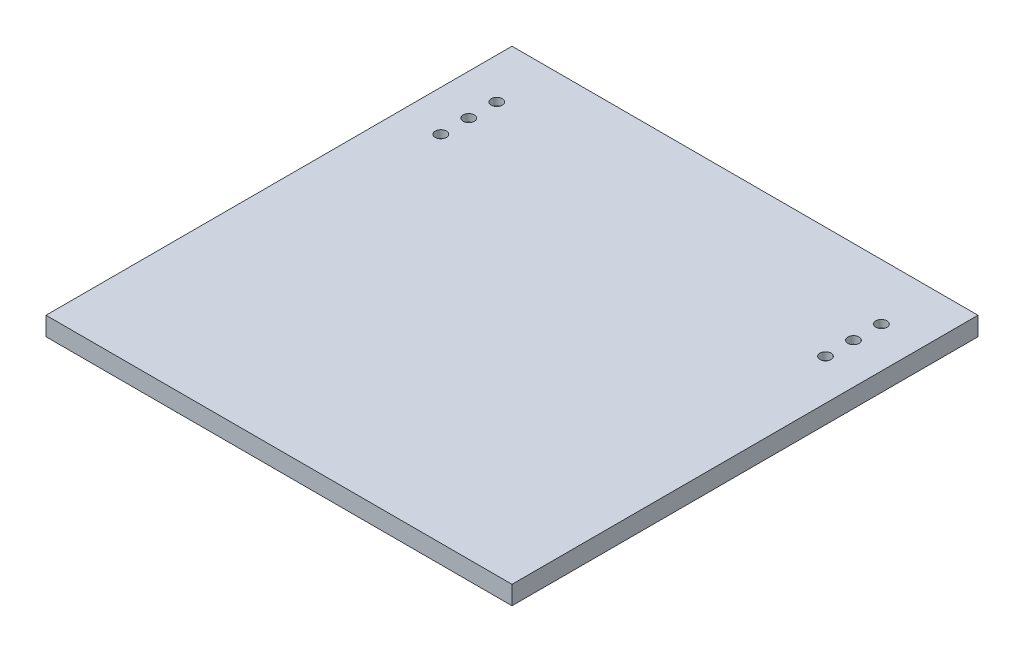
ISO-10303-21;
HEADER;
FILE_DESCRIPTION(('STEP AP214'),'2;1');
FILE_NAME('part.step','',(''),(''),'','','');
FILE_SCHEMA(('AUTOMOTIVE_DESIGN { 1 0 10303 214 1 1 1 1 }'));
ENDSEC;
DATA;
#1=APPLICATION_CONTEXT('core data for automotive mechanical design processes');
#2=APPLICATION_PROTOCOL_DEFINITION('international standard','automotive_design',2000,#1);
#3=PRODUCT_CONTEXT('',#1,'mechanical');
#4=PRODUCT('Part','Part','',(#3));
#5=PRODUCT_RELATED_PRODUCT_CATEGORY('part','',(#4));
#6=PRODUCT_DEFINITION_FORMATION('','',#4);
#7=PRODUCT_DEFINITION_CONTEXT('part definition',#1,'design');
#8=PRODUCT_DEFINITION('design','',#6,#7);
#9=PRODUCT_DEFINITION_SHAPE('','',#8);
#10=(LENGTH_UNIT() NAMED_UNIT(*) SI_UNIT(.MILLI.,.METRE.));
#11=(NAMED_UNIT(*) PLANE_ANGLE_UNIT() SI_UNIT($,.RADIAN.));
#12=(NAMED_UNIT(*) SI_UNIT($,.STERADIAN.) SOLID_ANGLE_UNIT());
#13=UNCERTAINTY_MEASURE_WITH_UNIT(LENGTH_MEASURE(1.E-05),#10,'distance_accuracy_value','');
#14=(GEOMETRIC_REPRESENTATION_CONTEXT(3) GLOBAL_UNCERTAINTY_ASSIGNED_CONTEXT((#13)) GLOBAL_UNIT_ASSIGNED_CONTEXT((#10,
#11,#12)) REPRESENTATION_CONTEXT('',''));
#15=CARTESIAN_POINT('',(0.,0.,0.));
#16=DIRECTION('',(0.,0.,1.));
#17=DIRECTION('',(1.,0.,0.));
#18=AXIS2_PLACEMENT_3D('',#15,#16,#17);
#19=CARTESIAN_POINT('',(0.,5.,0.));
#20=DIRECTION('',(1.,0.,0.));
#21=DIRECTION('',(0.,0.,-1.));
#22=AXIS2_PLACEMENT_3D('',#19,#20,#21);
#23=PLANE('',#22);
#24=DIRECTION('',(0.,0.,1.));
#25=VECTOR('',#24,1.);
#26=CARTESIAN_POINT('',(0.,0.,0.));
#27=LINE('',#26,#25);
#28=CARTESIAN_POINT('',(0.,0.,-125.));
#29=VERTEX_POINT('',#28);
#30=CARTESIAN_POINT('',(0.,0.,0.));
#31=VERTEX_POINT('',#30);
#32=EDGE_CURVE('E103',#29,#31,#27,.T.);
#33=ORIENTED_EDGE('',*,*,#32,.T.);
#34=DIRECTION('',(0.,-1.,0.));
#35=VECTOR('',#34,1.);
#36=CARTESIAN_POINT('',(0.,5.,0.));
#37=LINE('',#36,#35);
#38=CARTESIAN_POINT('',(0.,5.,0.));
#39=VERTEX_POINT('',#38);
#40=EDGE_CURVE('E11',#39,#31,#37,.T.);
#41=ORIENTED_EDGE('',*,*,#40,.F.);
#42=DIRECTION('',(0.,0.,1.));
#43=VECTOR('',#42,1.);
#44=CARTESIAN_POINT('',(0.,5.,0.));
#45=LINE('',#44,#43);
#46=CARTESIAN_POINT('',(0.,5.,-125.));
#47=VERTEX_POINT('',#46);
#48=EDGE_CURVE('E90',#47,#39,#45,.T.);
#49=ORIENTED_EDGE('',*,*,#48,.F.);
#50=DIRECTION('',(0.,-1.,0.));
#51=VECTOR('',#50,1.);
#52=CARTESIAN_POINT('',(0.,5.,-125.));
#53=LINE('',#52,#51);
#54=EDGE_CURVE('E99',#47,#29,#53,.T.);
#55=ORIENTED_EDGE('',*,*,#54,.T.);
#56=EDGE_LOOP('',(#33,#41,#49,#55));
#57=FACE_BOUND('',#56,.T.);
#58=ADVANCED_FACE('F37',(#57),#23,.F.);
#59=CARTESIAN_POINT('',(0.,5.,0.));
#60=DIRECTION('',(0.,0.,-1.));
#61=DIRECTION('',(-1.,0.,0.));
#62=AXIS2_PLACEMENT_3D('',#59,#60,#61);
#63=PLANE('',#62);
#64=DIRECTION('',(1.,0.,0.));
#65=VECTOR('',#64,1.);
#66=CARTESIAN_POINT('',(0.,0.,0.));
#67=LINE('',#66,#65);
#68=CARTESIAN_POINT('',(125.,0.,0.));
#69=VERTEX_POINT('',#68);
#70=EDGE_CURVE('E94',#31,#69,#67,.T.);
#71=ORIENTED_EDGE('',*,*,#70,.T.);
#72=DIRECTION('',(0.,-1.,0.));
#73=VECTOR('',#72,1.);
#74=CARTESIAN_POINT('',(125.,5.,0.));
#75=LINE('',#74,#73);
#76=CARTESIAN_POINT('',(125.,5.,0.));
#77=VERTEX_POINT('',#76);
#78=EDGE_CURVE('E46',#77,#69,#75,.T.);
#79=ORIENTED_EDGE('',*,*,#78,.F.);
#80=DIRECTION('',(1.,0.,0.));
#81=VECTOR('',#80,1.);
#82=CARTESIAN_POINT('',(0.,5.,0.));
#83=LINE('',#82,#81);
#84=EDGE_CURVE('E85',#39,#77,#83,.T.);
#85=ORIENTED_EDGE('',*,*,#84,.F.);
#86=ORIENTED_EDGE('',*,*,#40,.T.);
#87=EDGE_LOOP('',(#71,#79,#85,#86));
#88=FACE_BOUND('',#87,.T.);
#89=ADVANCED_FACE('F93',(#88),#63,.F.);
#90=CARTESIAN_POINT('',(125.,5.,0.));
#91=DIRECTION('',(-1.,0.,0.));
#92=DIRECTION('',(0.,0.,1.));
#93=AXIS2_PLACEMENT_3D('',#90,#91,#92);
#94=PLANE('',#93);
#95=DIRECTION('',(0.,0.,-1.));
#96=VECTOR('',#95,1.);
#97=CARTESIAN_POINT('',(125.,0.,0.));
#98=LINE('',#97,#96);
#99=CARTESIAN_POINT('',(125.,0.,-125.));
#100=VERTEX_POINT('',#99);
#101=EDGE_CURVE('E72',#69,#100,#98,.T.);
#102=ORIENTED_EDGE('',*,*,#101,.T.);
#103=DIRECTION('',(0.,-1.,0.));
#104=VECTOR('',#103,1.);
#105=CARTESIAN_POINT('',(125.,5.,-125.));
#106=LINE('',#105,#104);
#107=CARTESIAN_POINT('',(125.,5.,-125.));
#108=VERTEX_POINT('',#107);
#109=EDGE_CURVE('E95',#108,#100,#106,.T.);
#110=ORIENTED_EDGE('',*,*,#109,.F.);
#111=DIRECTION('',(0.,0.,-1.));
#112=VECTOR('',#111,1.);
#113=CARTESIAN_POINT('',(125.,5.,0.));
#114=LINE('',#113,#112);
#115=EDGE_CURVE('E88',#77,#108,#114,.T.);
#116=ORIENTED_EDGE('',*,*,#115,.F.);
#117=ORIENTED_EDGE('',*,*,#78,.T.);
#118=EDGE_LOOP('',(#102,#110,#116,#117));
#119=FACE_BOUND('',#118,.T.);
#120=ADVANCED_FACE('F97',(#119),#94,.F.);
#121=CARTESIAN_POINT('',(0.,5.,-125.));
#122=DIRECTION('',(0.,0.,1.));
#123=DIRECTION('',(1.,0.,0.));
#124=AXIS2_PLACEMENT_3D('',#121,#122,#123);
#125=PLANE('',#124);
#126=DIRECTION('',(-1.,0.,0.));
#127=VECTOR('',#126,1.);
#128=CARTESIAN_POINT('',(0.,0.,-125.));
#129=LINE('',#128,#127);
#130=EDGE_CURVE('E78',#100,#29,#129,.T.);
#131=ORIENTED_EDGE('',*,*,#130,.T.);
#132=ORIENTED_EDGE('',*,*,#54,.F.);
#133=DIRECTION('',(-1.,0.,0.));
#134=VECTOR('',#133,1.);
#135=CARTESIAN_POINT('',(0.,5.,-125.));
#136=LINE('',#135,#134);
#137=EDGE_CURVE('E55',#108,#47,#136,.T.);
#138=ORIENTED_EDGE('',*,*,#137,.F.);
#139=ORIENTED_EDGE('',*,*,#109,.T.);
#140=EDGE_LOOP('',(#131,#132,#138,#139));
#141=FACE_BOUND('',#140,.T.);
#142=ADVANCED_FACE('F188',(#141),#125,.F.);
#143=CARTESIAN_POINT('',(0.,5.,0.));
#144=DIRECTION('',(0.,-1.,0.));
#145=DIRECTION('',(0.,0.,-1.));
#146=AXIS2_PLACEMENT_3D('',#143,#144,#145);
#147=PLANE('',#146);
#148=CARTESIAN_POINT('',(114.09,5.,-102.5));
#149=DIRECTION('',(0.,1.,0.));
#150=DIRECTION('',(0.,0.,1.));
#151=AXIS2_PLACEMENT_3D('',#148,#149,#150);
#152=CIRCLE('',#151,1.5);
#153=CARTESIAN_POINT('',(114.09,5.,-101.));
#154=VERTEX_POINT('',#153);
#155=EDGE_CURVE('E162',#154,#154,#152,.T.);
#156=ORIENTED_EDGE('',*,*,#155,.F.);
#157=EDGE_LOOP('',(#156));
#158=FACE_BOUND('',#157,.T.);
#159=CARTESIAN_POINT('',(10.91,5.,-95.));
#160=DIRECTION('',(0.,1.,0.));
#161=DIRECTION('',(0.,0.,1.));
#162=AXIS2_PLACEMENT_3D('',#159,#160,#161);
#163=CIRCLE('',#162,1.5);
#164=CARTESIAN_POINT('',(10.91,5.,-93.5));
#165=VERTEX_POINT('',#164);
#166=EDGE_CURVE('E155',#165,#165,#163,.T.);
#167=ORIENTED_EDGE('',*,*,#166,.F.);
#168=EDGE_LOOP('',(#167));
#169=FACE_BOUND('',#168,.T.);
#170=CARTESIAN_POINT('',(114.09,5.,-95.));
#171=DIRECTION('',(0.,1.,0.));
#172=DIRECTION('',(0.,0.,1.));
#173=AXIS2_PLACEMENT_3D('',#170,#171,#172);
#174=CIRCLE('',#173,1.5);
#175=CARTESIAN_POINT('',(114.09,5.,-93.5));
#176=VERTEX_POINT('',#175);
#177=EDGE_CURVE('E174',#176,#176,#174,.T.);
#178=ORIENTED_EDGE('',*,*,#177,.F.);
#179=EDGE_LOOP('',(#178));
#180=FACE_BOUND('',#179,.T.);
#181=CARTESIAN_POINT('',(114.09,5.,-110.));
#182=DIRECTION('',(0.,1.,0.));
#183=DIRECTION('',(0.,0.,1.));
#184=AXIS2_PLACEMENT_3D('',#181,#182,#183);
#185=CIRCLE('',#184,1.5);
#186=CARTESIAN_POINT('',(114.09,5.,-108.5));
#187=VERTEX_POINT('',#186);
#188=EDGE_CURVE('E167',#187,#187,#185,.T.);
#189=ORIENTED_EDGE('',*,*,#188,.F.);
#190=EDGE_LOOP('',(#189));
#191=FACE_BOUND('',#190,.T.);
#192=CARTESIAN_POINT('',(10.91,5.,-102.5));
#193=DIRECTION('',(0.,1.,0.));
#194=DIRECTION('',(0.,0.,1.));
#195=AXIS2_PLACEMENT_3D('',#192,#193,#194);
#196=CIRCLE('',#195,1.5);
#197=CARTESIAN_POINT('',(10.91,5.,-101.));
#198=VERTEX_POINT('',#197);
#199=EDGE_CURVE('E149',#198,#198,#196,.T.);
#200=ORIENTED_EDGE('',*,*,#199,.F.);
#201=EDGE_LOOP('',(#200));
#202=FACE_BOUND('',#201,.T.);
#203=CARTESIAN_POINT('',(10.91,5.,-110.));
#204=DIRECTION('',(0.,1.,0.));
#205=DIRECTION('',(0.,0.,1.));
#206=AXIS2_PLACEMENT_3D('',#203,#204,#205);
#207=CIRCLE('',#206,1.5);
#208=CARTESIAN_POINT('',(10.91,5.,-108.5));
#209=VERTEX_POINT('',#208);
#210=EDGE_CURVE('E170',#209,#209,#207,.T.);
#211=ORIENTED_EDGE('',*,*,#210,.F.);
#212=EDGE_LOOP('',(#211));
#213=FACE_BOUND('',#212,.T.);
#214=ORIENTED_EDGE('',*,*,#48,.T.);
#215=ORIENTED_EDGE('',*,*,#84,.T.);
#216=ORIENTED_EDGE('',*,*,#115,.T.);
#217=ORIENTED_EDGE('',*,*,#137,.T.);
#218=EDGE_LOOP('',(#214,#215,#216,#217));
#219=FACE_BOUND('',#218,.T.);
#220=ADVANCED_FACE('F86',(#158,#169,#180,#191,#202,#213,#219),#147,.F.);
#221=CARTESIAN_POINT('',(0.,0.,0.));
#222=DIRECTION('',(0.,-1.,0.));
#223=DIRECTION('',(0.,0.,-1.));
#224=AXIS2_PLACEMENT_3D('',#221,#222,#223);
#225=PLANE('',#224);
#226=CARTESIAN_POINT('',(10.91,0.,-95.));
#227=DIRECTION('',(0.,1.,0.));
#228=DIRECTION('',(0.,0.,1.));
#229=AXIS2_PLACEMENT_3D('',#226,#227,#228);
#230=CIRCLE('',#229,0.799999999999999);
#231=CARTESIAN_POINT('',(10.91,0.,-94.2));
#232=VERTEX_POINT('',#231);
#233=EDGE_CURVE('E140',#232,#232,#230,.T.);
#234=ORIENTED_EDGE('',*,*,#233,.T.);
#235=EDGE_LOOP('',(#234));
#236=FACE_BOUND('',#235,.T.);
#237=CARTESIAN_POINT('',(10.91,0.,-110.));
#238=DIRECTION('',(0.,1.,0.));
#239=DIRECTION('',(0.,0.,1.));
#240=AXIS2_PLACEMENT_3D('',#237,#238,#239);
#241=CIRCLE('',#240,0.799999999999999);
#242=CARTESIAN_POINT('',(10.91,0.,-109.2));
#243=VERTEX_POINT('',#242);
#244=EDGE_CURVE('E130',#243,#243,#241,.T.);
#245=ORIENTED_EDGE('',*,*,#244,.T.);
#246=EDGE_LOOP('',(#245));
#247=FACE_BOUND('',#246,.T.);
#248=CARTESIAN_POINT('',(114.09,0.,-110.));
#249=DIRECTION('',(0.,1.,0.));
#250=DIRECTION('',(0.,0.,1.));
#251=AXIS2_PLACEMENT_3D('',#248,#249,#250);
#252=CIRCLE('',#251,0.799999999999995);
#253=CARTESIAN_POINT('',(114.09,0.,-109.2));
#254=VERTEX_POINT('',#253);
#255=EDGE_CURVE('E127',#254,#254,#252,.T.);
#256=ORIENTED_EDGE('',*,*,#255,.T.);
#257=EDGE_LOOP('',(#256));
#258=FACE_BOUND('',#257,.T.);
#259=CARTESIAN_POINT('',(114.09,0.,-95.));
#260=DIRECTION('',(0.,1.,0.));
#261=DIRECTION('',(0.,0.,1.));
#262=AXIS2_PLACEMENT_3D('',#259,#260,#261);
#263=CIRCLE('',#262,0.799999999999995);
#264=CARTESIAN_POINT('',(114.09,0.,-94.2));
#265=VERTEX_POINT('',#264);
#266=EDGE_CURVE('E124',#265,#265,#263,.T.);
#267=ORIENTED_EDGE('',*,*,#266,.T.);
#268=EDGE_LOOP('',(#267));
#269=FACE_BOUND('',#268,.T.);
#270=CARTESIAN_POINT('',(10.91,0.,-102.5));
#271=DIRECTION('',(0.,1.,0.));
#272=DIRECTION('',(0.,0.,1.));
#273=AXIS2_PLACEMENT_3D('',#270,#271,#272);
#274=CIRCLE('',#273,0.799999999999999);
#275=CARTESIAN_POINT('',(10.91,0.,-101.7));
#276=VERTEX_POINT('',#275);
#277=EDGE_CURVE('E120',#276,#276,#274,.T.);
#278=ORIENTED_EDGE('',*,*,#277,.T.);
#279=EDGE_LOOP('',(#278));
#280=FACE_BOUND('',#279,.T.);
#281=CARTESIAN_POINT('',(114.09,0.,-102.5));
#282=DIRECTION('',(0.,1.,0.));
#283=DIRECTION('',(0.,0.,1.));
#284=AXIS2_PLACEMENT_3D('',#281,#282,#283);
#285=CIRCLE('',#284,0.799999999999995);
#286=CARTESIAN_POINT('',(114.09,0.,-101.7));
#287=VERTEX_POINT('',#286);
#288=EDGE_CURVE('E116',#287,#287,#285,.T.);
#289=ORIENTED_EDGE('',*,*,#288,.T.);
#290=EDGE_LOOP('',(#289));
#291=FACE_BOUND('',#290,.T.);
#292=ORIENTED_EDGE('',*,*,#32,.F.);
#293=ORIENTED_EDGE('',*,*,#130,.F.);
#294=ORIENTED_EDGE('',*,*,#101,.F.);
#295=ORIENTED_EDGE('',*,*,#70,.F.);
#296=EDGE_LOOP('',(#292,#293,#294,#295));
#297=FACE_BOUND('',#296,.T.);
#298=ADVANCED_FACE('F187',(#236,#247,#258,#269,#280,#291,#297),#225,.T.);
#299=CARTESIAN_POINT('',(10.91,3.,-110.));
#300=DIRECTION('',(0.,1.,0.));
#301=DIRECTION('',(0.,0.,1.));
#302=AXIS2_PLACEMENT_3D('',#299,#300,#301);
#303=CYLINDRICAL_SURFACE('',#302,1.5);
#304=CARTESIAN_POINT('',(10.91,3.,-110.));
#305=DIRECTION('',(0.,1.,0.));
#306=DIRECTION('',(0.,0.,1.));
#307=AXIS2_PLACEMENT_3D('',#304,#305,#306);
#308=CIRCLE('',#307,1.5);
#309=CARTESIAN_POINT('',(10.91,3.,-108.5));
#310=VERTEX_POINT('',#309);
#311=EDGE_CURVE('E106',#310,#310,#308,.T.);
#312=ORIENTED_EDGE('',*,*,#311,.F.);
#313=EDGE_LOOP('',(#312));
#314=FACE_BOUND('',#313,.T.);
#315=ORIENTED_EDGE('',*,*,#210,.T.);
#316=EDGE_LOOP('',(#315));
#317=FACE_BOUND('',#316,.T.);
#318=ADVANCED_FACE('F184',(#314,#317),#303,.F.);
#319=CARTESIAN_POINT('',(10.91,3.,-110.));
#320=DIRECTION('',(0.,1.,0.));
#321=DIRECTION('',(0.,0.,1.));
#322=AXIS2_PLACEMENT_3D('',#319,#320,#321);
#323=PLANE('',#322);
#324=CARTESIAN_POINT('',(10.91,3.,-110.));
#325=DIRECTION('',(0.,1.,0.));
#326=DIRECTION('',(0.,0.,1.));
#327=AXIS2_PLACEMENT_3D('',#324,#325,#326);
#328=CIRCLE('',#327,0.799999999999999);
#329=CARTESIAN_POINT('',(10.91,3.,-109.2));
#330=VERTEX_POINT('',#329);
#331=EDGE_CURVE('E128',#330,#330,#328,.T.);
#332=ORIENTED_EDGE('',*,*,#331,.F.);
#333=EDGE_LOOP('',(#332));
#334=FACE_BOUND('',#333,.T.);
#335=ORIENTED_EDGE('',*,*,#311,.T.);
#336=EDGE_LOOP('',(#335));
#337=FACE_BOUND('',#336,.T.);
#338=ADVANCED_FACE('F234',(#334,#337),#323,.T.);
#339=CARTESIAN_POINT('',(10.91,3.,-102.5));
#340=DIRECTION('',(0.,1.,0.));
#341=DIRECTION('',(0.,0.,1.));
#342=AXIS2_PLACEMENT_3D('',#339,#340,#341);
#343=CYLINDRICAL_SURFACE('',#342,1.5);
#344=CARTESIAN_POINT('',(10.91,3.,-102.5));
#345=DIRECTION('',(0.,1.,0.));
#346=DIRECTION('',(0.,0.,1.));
#347=AXIS2_PLACEMENT_3D('',#344,#345,#346);
#348=CIRCLE('',#347,1.5);
#349=CARTESIAN_POINT('',(10.91,3.,-101.));
#350=VERTEX_POINT('',#349);
#351=EDGE_CURVE('E115',#350,#350,#348,.T.);
#352=ORIENTED_EDGE('',*,*,#351,.F.);
#353=EDGE_LOOP('',(#352));
#354=FACE_BOUND('',#353,.T.);
#355=ORIENTED_EDGE('',*,*,#199,.T.);
#356=EDGE_LOOP('',(#355));
#357=FACE_BOUND('',#356,.T.);
#358=ADVANCED_FACE('F242',(#354,#357),#343,.F.);
#359=CARTESIAN_POINT('',(10.91,3.,-102.5));
#360=DIRECTION('',(0.,1.,0.));
#361=DIRECTION('',(0.,0.,1.));
#362=AXIS2_PLACEMENT_3D('',#359,#360,#361);
#363=PLANE('',#362);
#364=CARTESIAN_POINT('',(10.91,3.,-102.5));
#365=DIRECTION('',(0.,1.,0.));
#366=DIRECTION('',(0.,0.,1.));
#367=AXIS2_PLACEMENT_3D('',#364,#365,#366);
#368=CIRCLE('',#367,0.799999999999999);
#369=CARTESIAN_POINT('',(10.91,3.,-101.7));
#370=VERTEX_POINT('',#369);
#371=EDGE_CURVE('E117',#370,#370,#368,.T.);
#372=ORIENTED_EDGE('',*,*,#371,.F.);
#373=EDGE_LOOP('',(#372));
#374=FACE_BOUND('',#373,.T.);
#375=ORIENTED_EDGE('',*,*,#351,.T.);
#376=EDGE_LOOP('',(#375));
#377=FACE_BOUND('',#376,.T.);
#378=ADVANCED_FACE('F247',(#374,#377),#363,.T.);
#379=CARTESIAN_POINT('',(114.09,3.,-110.));
#380=DIRECTION('',(0.,1.,0.));
#381=DIRECTION('',(0.,0.,1.));
#382=AXIS2_PLACEMENT_3D('',#379,#380,#381);
#383=CYLINDRICAL_SURFACE('',#382,1.5);
#384=CARTESIAN_POINT('',(114.09,3.,-110.));
#385=DIRECTION('',(0.,1.,0.));
#386=DIRECTION('',(0.,0.,1.));
#387=AXIS2_PLACEMENT_3D('',#384,#385,#386);
#388=CIRCLE('',#387,1.5);
#389=CARTESIAN_POINT('',(114.09,3.,-108.5));
#390=VERTEX_POINT('',#389);
#391=EDGE_CURVE('E171',#390,#390,#388,.T.);
#392=ORIENTED_EDGE('',*,*,#391,.F.);
#393=EDGE_LOOP('',(#392));
#394=FACE_BOUND('',#393,.T.);
#395=ORIENTED_EDGE('',*,*,#188,.T.);
#396=EDGE_LOOP('',(#395));
#397=FACE_BOUND('',#396,.T.);
#398=ADVANCED_FACE('F256',(#394,#397),#383,.F.);
#399=CARTESIAN_POINT('',(114.09,3.,-110.));
#400=DIRECTION('',(0.,1.,0.));
#401=DIRECTION('',(0.,0.,1.));
#402=AXIS2_PLACEMENT_3D('',#399,#400,#401);
#403=PLANE('',#402);
#404=CARTESIAN_POINT('',(114.09,3.,-110.));
#405=DIRECTION('',(0.,1.,0.));
#406=DIRECTION('',(0.,0.,1.));
#407=AXIS2_PLACEMENT_3D('',#404,#405,#406);
#408=CIRCLE('',#407,0.799999999999995);
#409=CARTESIAN_POINT('',(114.09,3.,-109.2));
#410=VERTEX_POINT('',#409);
#411=EDGE_CURVE('E125',#410,#410,#408,.T.);
#412=ORIENTED_EDGE('',*,*,#411,.F.);
#413=EDGE_LOOP('',(#412));
#414=FACE_BOUND('',#413,.T.);
#415=ORIENTED_EDGE('',*,*,#391,.T.);
#416=EDGE_LOOP('',(#415));
#417=FACE_BOUND('',#416,.T.);
#418=ADVANCED_FACE('F261',(#414,#417),#403,.T.);
#419=CARTESIAN_POINT('',(114.09,3.,-95.));
#420=DIRECTION('',(0.,1.,0.));
#421=DIRECTION('',(0.,0.,1.));
#422=AXIS2_PLACEMENT_3D('',#419,#420,#421);
#423=CYLINDRICAL_SURFACE('',#422,1.5);
#424=CARTESIAN_POINT('',(114.09,3.,-95.));
#425=DIRECTION('',(0.,1.,0.));
#426=DIRECTION('',(0.,0.,1.));
#427=AXIS2_PLACEMENT_3D('',#424,#425,#426);
#428=CIRCLE('',#427,1.5);
#429=CARTESIAN_POINT('',(114.09,3.,-93.5));
#430=VERTEX_POINT('',#429);
#431=EDGE_CURVE('E158',#430,#430,#428,.T.);
#432=ORIENTED_EDGE('',*,*,#431,.F.);
#433=EDGE_LOOP('',(#432));
#434=FACE_BOUND('',#433,.T.);
#435=ORIENTED_EDGE('',*,*,#177,.T.);
#436=EDGE_LOOP('',(#435));
#437=FACE_BOUND('',#436,.T.);
#438=ADVANCED_FACE('F270',(#434,#437),#423,.F.);
#439=CARTESIAN_POINT('',(114.09,3.,-95.));
#440=DIRECTION('',(0.,1.,0.));
#441=DIRECTION('',(0.,0.,1.));
#442=AXIS2_PLACEMENT_3D('',#439,#440,#441);
#443=PLANE('',#442);
#444=CARTESIAN_POINT('',(114.09,3.,-95.));
#445=DIRECTION('',(0.,1.,0.));
#446=DIRECTION('',(0.,0.,1.));
#447=AXIS2_PLACEMENT_3D('',#444,#445,#446);
#448=CIRCLE('',#447,0.799999999999995);
#449=CARTESIAN_POINT('',(114.09,3.,-94.2));
#450=VERTEX_POINT('',#449);
#451=EDGE_CURVE('E121',#450,#450,#448,.T.);
#452=ORIENTED_EDGE('',*,*,#451,.F.);
#453=EDGE_LOOP('',(#452));
#454=FACE_BOUND('',#453,.T.);
#455=ORIENTED_EDGE('',*,*,#431,.T.);
#456=EDGE_LOOP('',(#455));
#457=FACE_BOUND('',#456,.T.);
#458=ADVANCED_FACE('F275',(#454,#457),#443,.T.);
#459=CARTESIAN_POINT('',(10.91,3.,-95.));
#460=DIRECTION('',(0.,1.,0.));
#461=DIRECTION('',(0.,0.,1.));
#462=AXIS2_PLACEMENT_3D('',#459,#460,#461);
#463=CYLINDRICAL_SURFACE('',#462,1.5);
#464=CARTESIAN_POINT('',(10.91,3.,-95.));
#465=DIRECTION('',(0.,1.,0.));
#466=DIRECTION('',(0.,0.,1.));
#467=AXIS2_PLACEMENT_3D('',#464,#465,#466);
#468=CIRCLE('',#467,1.5);
#469=CARTESIAN_POINT('',(10.91,3.,-93.5));
#470=VERTEX_POINT('',#469);
#471=EDGE_CURVE('E159',#470,#470,#468,.T.);
#472=ORIENTED_EDGE('',*,*,#471,.F.);
#473=EDGE_LOOP('',(#472));
#474=FACE_BOUND('',#473,.T.);
#475=ORIENTED_EDGE('',*,*,#166,.T.);
#476=EDGE_LOOP('',(#475));
#477=FACE_BOUND('',#476,.T.);
#478=ADVANCED_FACE('F284',(#474,#477),#463,.F.);
#479=CARTESIAN_POINT('',(10.91,3.,-95.));
#480=DIRECTION('',(0.,1.,0.));
#481=DIRECTION('',(0.,0.,1.));
#482=AXIS2_PLACEMENT_3D('',#479,#480,#481);
#483=PLANE('',#482);
#484=CARTESIAN_POINT('',(10.91,3.,-95.));
#485=DIRECTION('',(0.,1.,0.));
#486=DIRECTION('',(0.,0.,1.));
#487=AXIS2_PLACEMENT_3D('',#484,#485,#486);
#488=CIRCLE('',#487,0.799999999999999);
#489=CARTESIAN_POINT('',(10.91,3.,-94.2));
#490=VERTEX_POINT('',#489);
#491=EDGE_CURVE('E40',#490,#490,#488,.T.);
#492=ORIENTED_EDGE('',*,*,#491,.F.);
#493=EDGE_LOOP('',(#492));
#494=FACE_BOUND('',#493,.T.);
#495=ORIENTED_EDGE('',*,*,#471,.T.);
#496=EDGE_LOOP('',(#495));
#497=FACE_BOUND('',#496,.T.);
#498=ADVANCED_FACE('F289',(#494,#497),#483,.T.);
#499=CARTESIAN_POINT('',(114.09,3.,-102.5));
#500=DIRECTION('',(0.,1.,0.));
#501=DIRECTION('',(0.,0.,1.));
#502=AXIS2_PLACEMENT_3D('',#499,#500,#501);
#503=CYLINDRICAL_SURFACE('',#502,1.5);
#504=CARTESIAN_POINT('',(114.09,3.,-102.5));
#505=DIRECTION('',(0.,1.,0.));
#506=DIRECTION('',(0.,0.,1.));
#507=AXIS2_PLACEMENT_3D('',#504,#505,#506);
#508=CIRCLE('',#507,1.5);
#509=CARTESIAN_POINT('',(114.09,3.,-101.));
#510=VERTEX_POINT('',#509);
#511=EDGE_CURVE('E152',#510,#510,#508,.T.);
#512=ORIENTED_EDGE('',*,*,#511,.F.);
#513=EDGE_LOOP('',(#512));
#514=FACE_BOUND('',#513,.T.);
#515=ORIENTED_EDGE('',*,*,#155,.T.);
#516=EDGE_LOOP('',(#515));
#517=FACE_BOUND('',#516,.T.);
#518=ADVANCED_FACE('F298',(#514,#517),#503,.F.);
#519=CARTESIAN_POINT('',(114.09,3.,-102.5));
#520=DIRECTION('',(0.,1.,0.));
#521=DIRECTION('',(0.,0.,1.));
#522=AXIS2_PLACEMENT_3D('',#519,#520,#521);
#523=PLANE('',#522);
#524=CARTESIAN_POINT('',(114.09,3.,-102.5));
#525=DIRECTION('',(0.,1.,0.));
#526=DIRECTION('',(0.,0.,1.));
#527=AXIS2_PLACEMENT_3D('',#524,#525,#526);
#528=CIRCLE('',#527,0.799999999999995);
#529=CARTESIAN_POINT('',(114.09,3.,-101.7));
#530=VERTEX_POINT('',#529);
#531=EDGE_CURVE('E112',#530,#530,#528,.T.);
#532=ORIENTED_EDGE('',*,*,#531,.F.);
#533=EDGE_LOOP('',(#532));
#534=FACE_BOUND('',#533,.T.);
#535=ORIENTED_EDGE('',*,*,#511,.T.);
#536=EDGE_LOOP('',(#535));
#537=FACE_BOUND('',#536,.T.);
#538=ADVANCED_FACE('F303',(#534,#537),#523,.T.);
#539=CARTESIAN_POINT('',(114.09,5.,-102.5));
#540=DIRECTION('',(0.,1.,0.));
#541=DIRECTION('',(0.,0.,1.));
#542=AXIS2_PLACEMENT_3D('',#539,#540,#541);
#543=CYLINDRICAL_SURFACE('',#542,0.799999999999995);
#544=ORIENTED_EDGE('',*,*,#531,.T.);
#545=EDGE_LOOP('',(#544));
#546=FACE_BOUND('',#545,.T.);
#547=ORIENTED_EDGE('',*,*,#288,.F.);
#548=EDGE_LOOP('',(#547));
#549=FACE_BOUND('',#548,.T.);
#550=ADVANCED_FACE('F360',(#546,#549),#543,.F.);
#551=CARTESIAN_POINT('',(10.91,5.,-102.5));
#552=DIRECTION('',(0.,1.,0.));
#553=DIRECTION('',(0.,0.,1.));
#554=AXIS2_PLACEMENT_3D('',#551,#552,#553);
#555=CYLINDRICAL_SURFACE('',#554,0.799999999999999);
#556=ORIENTED_EDGE('',*,*,#371,.T.);
#557=EDGE_LOOP('',(#556));
#558=FACE_BOUND('',#557,.T.);
#559=ORIENTED_EDGE('',*,*,#277,.F.);
#560=EDGE_LOOP('',(#559));
#561=FACE_BOUND('',#560,.T.);
#562=ADVANCED_FACE('F371',(#558,#561),#555,.F.);
#563=CARTESIAN_POINT('',(114.09,5.,-95.));
#564=DIRECTION('',(0.,1.,0.));
#565=DIRECTION('',(0.,0.,1.));
#566=AXIS2_PLACEMENT_3D('',#563,#564,#565);
#567=CYLINDRICAL_SURFACE('',#566,0.799999999999995);
#568=ORIENTED_EDGE('',*,*,#451,.T.);
#569=EDGE_LOOP('',(#568));
#570=FACE_BOUND('',#569,.T.);
#571=ORIENTED_EDGE('',*,*,#266,.F.);
#572=EDGE_LOOP('',(#571));
#573=FACE_BOUND('',#572,.T.);
#574=ADVANCED_FACE('F382',(#570,#573),#567,.F.);
#575=CARTESIAN_POINT('',(114.09,5.,-110.));
#576=DIRECTION('',(0.,1.,0.));
#577=DIRECTION('',(0.,0.,1.));
#578=AXIS2_PLACEMENT_3D('',#575,#576,#577);
#579=CYLINDRICAL_SURFACE('',#578,0.799999999999995);
#580=ORIENTED_EDGE('',*,*,#411,.T.);
#581=EDGE_LOOP('',(#580));
#582=FACE_BOUND('',#581,.T.);
#583=ORIENTED_EDGE('',*,*,#255,.F.);
#584=EDGE_LOOP('',(#583));
#585=FACE_BOUND('',#584,.T.);
#586=ADVANCED_FACE('F393',(#582,#585),#579,.F.);
#587=CARTESIAN_POINT('',(10.91,5.,-110.));
#588=DIRECTION('',(0.,1.,0.));
#589=DIRECTION('',(0.,0.,1.));
#590=AXIS2_PLACEMENT_3D('',#587,#588,#589);
#591=CYLINDRICAL_SURFACE('',#590,0.799999999999999);
#592=ORIENTED_EDGE('',*,*,#331,.T.);
#593=EDGE_LOOP('',(#592));
#594=FACE_BOUND('',#593,.T.);
#595=ORIENTED_EDGE('',*,*,#244,.F.);
#596=EDGE_LOOP('',(#595));
#597=FACE_BOUND('',#596,.T.);
#598=ADVANCED_FACE('F404',(#594,#597),#591,.F.);
#599=CARTESIAN_POINT('',(10.91,5.,-95.));
#600=DIRECTION('',(0.,1.,0.));
#601=DIRECTION('',(0.,0.,1.));
#602=AXIS2_PLACEMENT_3D('',#599,#600,#601);
#603=CYLINDRICAL_SURFACE('',#602,0.799999999999999);
#604=ORIENTED_EDGE('',*,*,#491,.T.);
#605=EDGE_LOOP('',(#604));
#606=FACE_BOUND('',#605,.T.);
#607=ORIENTED_EDGE('',*,*,#233,.F.);
#608=EDGE_LOOP('',(#607));
#609=FACE_BOUND('',#608,.T.);
#610=ADVANCED_FACE('F415',(#606,#609),#603,.F.);
#611=CLOSED_SHELL('',(#58,#89,#120,#142,#220,#298,#318,#338,#358,#378,#398,#418,#438,#458,#478,
#498,#518,#538,#550,#562,#574,#586,#598,#610));
#612=MANIFOLD_SOLID_BREP('B2',#611);
#613=ADVANCED_BREP_SHAPE_REPRESENTATION('',(#18,#612),#14);
#614=SHAPE_DEFINITION_REPRESENTATION(#9,#613);
ENDSEC;
END-ISO-10303-21;
